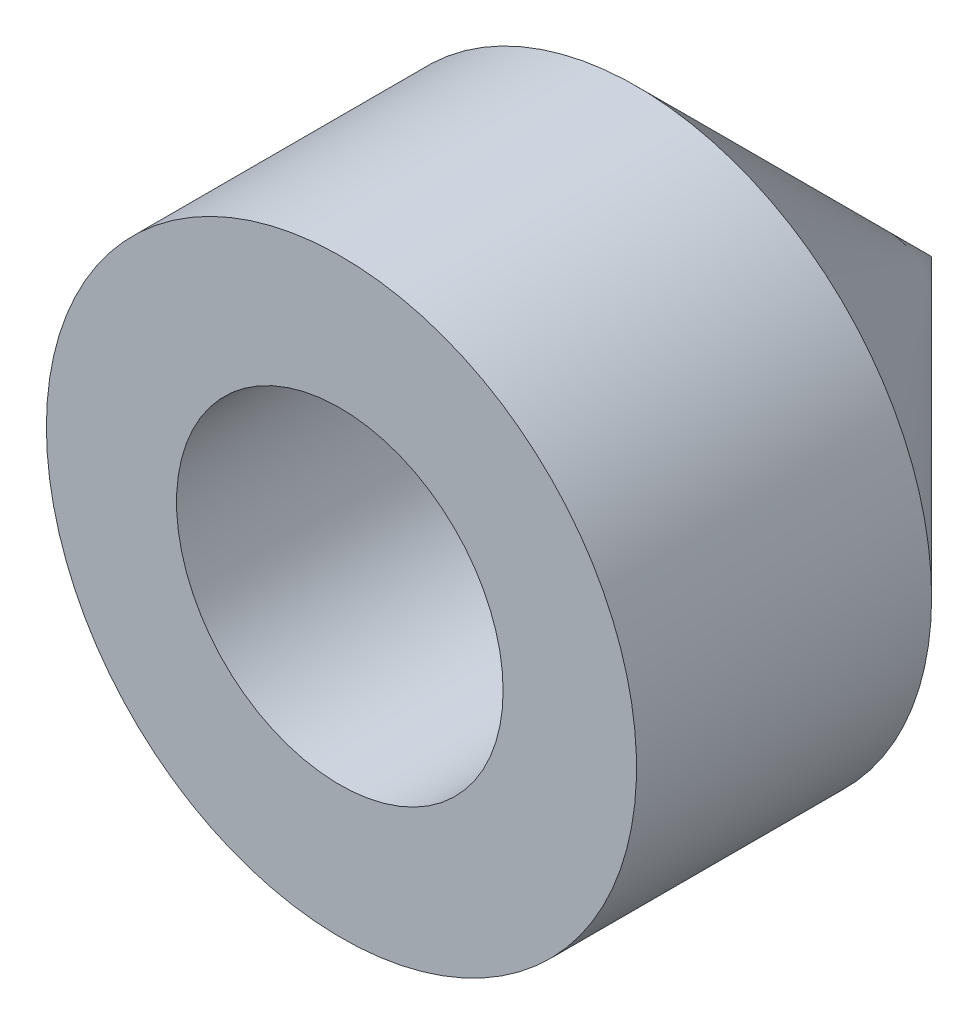
ISO-10303-21;
HEADER;
FILE_DESCRIPTION(('STEP AP214'),'2;1');
FILE_NAME('part.step','',(''),(''),'','','');
FILE_SCHEMA(('AUTOMOTIVE_DESIGN { 1 0 10303 214 1 1 1 1 }'));
ENDSEC;
DATA;
#1=APPLICATION_CONTEXT('core data for automotive mechanical design processes');
#2=APPLICATION_PROTOCOL_DEFINITION('international standard','automotive_design',2000,#1);
#3=PRODUCT_CONTEXT('',#1,'mechanical');
#4=PRODUCT('Part','Part','',(#3));
#5=PRODUCT_RELATED_PRODUCT_CATEGORY('part','',(#4));
#6=PRODUCT_DEFINITION_FORMATION('','',#4);
#7=PRODUCT_DEFINITION_CONTEXT('part definition',#1,'design');
#8=PRODUCT_DEFINITION('design','',#6,#7);
#9=PRODUCT_DEFINITION_SHAPE('','',#8);
#10=(LENGTH_UNIT() NAMED_UNIT(*) SI_UNIT(.MILLI.,.METRE.));
#11=(NAMED_UNIT(*) PLANE_ANGLE_UNIT() SI_UNIT($,.RADIAN.));
#12=(NAMED_UNIT(*) SI_UNIT($,.STERADIAN.) SOLID_ANGLE_UNIT());
#13=UNCERTAINTY_MEASURE_WITH_UNIT(LENGTH_MEASURE(1.E-05),#10,'distance_accuracy_value','');
#14=(GEOMETRIC_REPRESENTATION_CONTEXT(3) GLOBAL_UNCERTAINTY_ASSIGNED_CONTEXT((#13)) GLOBAL_UNIT_ASSIGNED_CONTEXT((#10,
#11,#12)) REPRESENTATION_CONTEXT('',''));
#15=CARTESIAN_POINT('',(0.,0.,0.));
#16=DIRECTION('',(0.,0.,1.));
#17=DIRECTION('',(1.,0.,0.));
#18=AXIS2_PLACEMENT_3D('',#15,#16,#17);
#19=CARTESIAN_POINT('',(-30.0880851873656,0.,-66.2918478515674));
#20=DIRECTION('',(0.,0.,-1.));
#21=DIRECTION('',(-1.,0.,0.));
#22=AXIS2_PLACEMENT_3D('',#19,#20,#21);
#23=PLANE('',#22);
#24=CARTESIAN_POINT('',(-30.19891378146,0.,-66.2918478515674));
#25=DIRECTION('',(0.,0.,1.));
#26=DIRECTION('',(1.,0.,0.));
#27=AXIS2_PLACEMENT_3D('',#24,#25,#26);
#28=CIRCLE('',#27,11.0675517775195);
#29=CARTESIAN_POINT('',(-19.1313620039405,0.,-66.2918478515674));
#30=VERTEX_POINT('',#29);
#31=EDGE_CURVE('E67',#30,#30,#28,.T.);
#32=ORIENTED_EDGE('',*,*,#31,.F.);
#33=EDGE_LOOP('',(#32));
#34=FACE_BOUND('',#33,.T.);
#35=CARTESIAN_POINT('',(-30.0880851873656,0.,-66.2918478515674));
#36=DIRECTION('',(0.,0.,-1.));
#37=DIRECTION('',(-1.,0.,0.));
#38=AXIS2_PLACEMENT_3D('',#35,#36,#37);
#39=CIRCLE('',#38,20.);
#40=CARTESIAN_POINT('',(-50.0880851873656,0.,-66.2918478515674));
#41=VERTEX_POINT('',#40);
#42=EDGE_CURVE('E11',#41,#41,#39,.T.);
#43=ORIENTED_EDGE('',*,*,#42,.F.);
#44=EDGE_LOOP('',(#43));
#45=FACE_BOUND('',#44,.T.);
#46=ADVANCED_FACE('F44',(#34,#45),#23,.F.);
#47=CARTESIAN_POINT('',(-30.0880851873656,0.,-86.2918478515674));
#48=DIRECTION('',(0.,0.,-1.));
#49=DIRECTION('',(-1.,0.,0.));
#50=AXIS2_PLACEMENT_3D('',#47,#48,#49);
#51=CYLINDRICAL_SURFACE('',#50,20.);
#52=CARTESIAN_POINT('',(-30.0880851873656,0.,-86.2918478515674));
#53=DIRECTION('',(0.,0.,-1.));
#54=DIRECTION('',(-1.,0.,0.));
#55=AXIS2_PLACEMENT_3D('',#52,#53,#54);
#56=CIRCLE('',#55,20.);
#57=CARTESIAN_POINT('',(-50.0880851873656,0.,-86.2918478515674));
#58=VERTEX_POINT('',#57);
#59=EDGE_CURVE('E51',#58,#58,#56,.T.);
#60=ORIENTED_EDGE('',*,*,#59,.F.);
#61=EDGE_LOOP('',(#60));
#62=FACE_BOUND('',#61,.T.);
#63=ORIENTED_EDGE('',*,*,#42,.T.);
#64=EDGE_LOOP('',(#63));
#65=FACE_BOUND('',#64,.T.);
#66=ADVANCED_FACE('F58',(#62,#65),#51,.T.);
#67=CARTESIAN_POINT('',(-30.0880851873656,0.,-86.2918478515674));
#68=DIRECTION('',(0.,0.,1.));
#69=DIRECTION('',(1.,0.,0.));
#70=AXIS2_PLACEMENT_3D('',#67,#68,#69);
#71=CONICAL_SURFACE('',#70,20.,0.785398163397448);
#72=CARTESIAN_POINT('',(-30.0880851873656,0.,-106.291847851567));
#73=VERTEX_POINT('',#72);
#74=VERTEX_LOOP('',#73);
#75=FACE_BOUND('',#74,.T.);
#76=ORIENTED_EDGE('',*,*,#59,.T.);
#77=EDGE_LOOP('',(#76));
#78=FACE_BOUND('',#77,.T.);
#79=ADVANCED_FACE('F54',(#75,#78),#71,.T.);
#80=CARTESIAN_POINT('',(-30.19891378146,0.,-86.2918478515674));
#81=DIRECTION('',(0.,0.,1.));
#82=DIRECTION('',(1.,0.,0.));
#83=AXIS2_PLACEMENT_3D('',#80,#81,#82);
#84=CYLINDRICAL_SURFACE('',#83,11.0675517775195);
#85=CARTESIAN_POINT('',(-30.19891378146,0.,-86.2918478515674));
#86=DIRECTION('',(0.,0.,1.));
#87=DIRECTION('',(1.,0.,0.));
#88=AXIS2_PLACEMENT_3D('',#85,#86,#87);
#89=CIRCLE('',#88,11.0675517775195);
#90=CARTESIAN_POINT('',(-19.1313620039405,0.,-86.2918478515674));
#91=VERTEX_POINT('',#90);
#92=EDGE_CURVE('E64',#91,#91,#89,.T.);
#93=ORIENTED_EDGE('',*,*,#92,.F.);
#94=EDGE_LOOP('',(#93));
#95=FACE_BOUND('',#94,.T.);
#96=ORIENTED_EDGE('',*,*,#31,.T.);
#97=EDGE_LOOP('',(#96));
#98=FACE_BOUND('',#97,.T.);
#99=ADVANCED_FACE('F57',(#95,#98),#84,.F.);
#100=CARTESIAN_POINT('',(-30.19891378146,0.,-86.2918478515674));
#101=DIRECTION('',(0.,0.,1.));
#102=DIRECTION('',(1.,0.,0.));
#103=AXIS2_PLACEMENT_3D('',#100,#101,#102);
#104=PLANE('',#103);
#105=ORIENTED_EDGE('',*,*,#92,.T.);
#106=EDGE_LOOP('',(#105));
#107=FACE_BOUND('',#106,.T.);
#108=ADVANCED_FACE('F85',(#107),#104,.T.);
#109=CLOSED_SHELL('',(#46,#66,#79,#99,#108));
#110=MANIFOLD_SOLID_BREP('B2',#109);
#111=ADVANCED_BREP_SHAPE_REPRESENTATION('',(#18,#110),#14);
#112=SHAPE_DEFINITION_REPRESENTATION(#9,#111);
ENDSEC;
END-ISO-10303-21;
